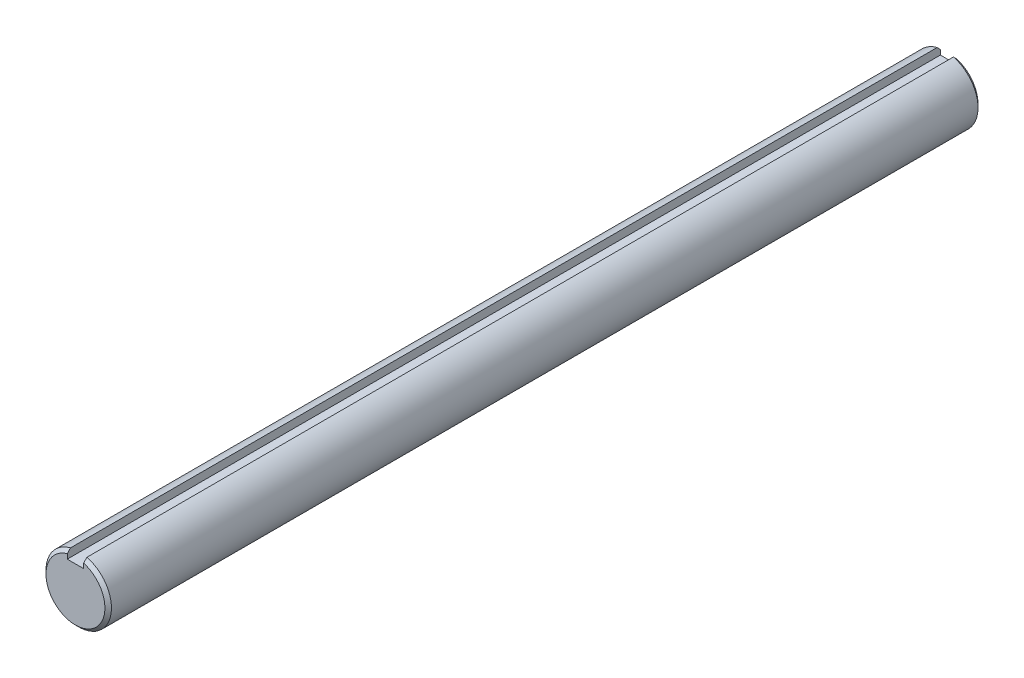
ISO-10303-21;
HEADER;
FILE_DESCRIPTION(('STEP AP214'),'2;1');
FILE_NAME('part.step','',(''),(''),'','','');
FILE_SCHEMA(('AUTOMOTIVE_DESIGN { 1 0 10303 214 1 1 1 1 }'));
ENDSEC;
DATA;
#1=APPLICATION_CONTEXT('core data for automotive mechanical design processes');
#2=APPLICATION_PROTOCOL_DEFINITION('international standard','automotive_design',2000,#1);
#3=PRODUCT_CONTEXT('',#1,'mechanical');
#4=PRODUCT('Part','Part','',(#3));
#5=PRODUCT_RELATED_PRODUCT_CATEGORY('part','',(#4));
#6=PRODUCT_DEFINITION_FORMATION('','',#4);
#7=PRODUCT_DEFINITION_CONTEXT('part definition',#1,'design');
#8=PRODUCT_DEFINITION('design','',#6,#7);
#9=PRODUCT_DEFINITION_SHAPE('','',#8);
#10=(LENGTH_UNIT() NAMED_UNIT(*) SI_UNIT(.MILLI.,.METRE.));
#11=(NAMED_UNIT(*) PLANE_ANGLE_UNIT() SI_UNIT($,.RADIAN.));
#12=(NAMED_UNIT(*) SI_UNIT($,.STERADIAN.) SOLID_ANGLE_UNIT());
#13=UNCERTAINTY_MEASURE_WITH_UNIT(LENGTH_MEASURE(1.E-05),#10,'distance_accuracy_value','');
#14=(GEOMETRIC_REPRESENTATION_CONTEXT(3) GLOBAL_UNCERTAINTY_ASSIGNED_CONTEXT((#13)) GLOBAL_UNIT_ASSIGNED_CONTEXT((#10,
#11,#12)) REPRESENTATION_CONTEXT('',''));
#15=CARTESIAN_POINT('',(0.,0.,0.));
#16=DIRECTION('',(0.,0.,1.));
#17=DIRECTION('',(1.,0.,0.));
#18=AXIS2_PLACEMENT_3D('',#15,#16,#17);
#19=CARTESIAN_POINT('',(0.,0.,127.));
#20=DIRECTION('',(0.,0.,-1.));
#21=DIRECTION('',(-1.,0.,0.));
#22=AXIS2_PLACEMENT_3D('',#19,#20,#21);
#23=CYLINDRICAL_SURFACE('',#22,9.525);
#24=DIRECTION('',(0.,0.,-1.));
#25=VECTOR('',#24,1.);
#26=CARTESIAN_POINT('',(-2.38125,9.22254159315641,127.));
#27=LINE('',#26,#25);
#28=CARTESIAN_POINT('',(-2.38125,9.22254159315641,126.0475));
#29=VERTEX_POINT('',#28);
#30=CARTESIAN_POINT('',(-2.38125,9.22254159315641,-126.0475));
#31=VERTEX_POINT('',#30);
#32=EDGE_CURVE('E122',#29,#31,#27,.T.);
#33=ORIENTED_EDGE('',*,*,#32,.T.);
#34=CARTESIAN_POINT('',(0.,0.,-126.0475));
#35=DIRECTION('',(0.,0.,1.));
#36=DIRECTION('',(1.,0.,0.));
#37=AXIS2_PLACEMENT_3D('',#34,#35,#36);
#38=CIRCLE('',#37,9.525);
#39=CARTESIAN_POINT('',(2.38125,9.22254159315641,-126.0475));
#40=VERTEX_POINT('',#39);
#41=EDGE_CURVE('E133',#31,#40,#38,.T.);
#42=ORIENTED_EDGE('',*,*,#41,.T.);
#43=DIRECTION('',(0.,0.,-1.));
#44=VECTOR('',#43,1.);
#45=CARTESIAN_POINT('',(2.38125,9.22254159315641,127.));
#46=LINE('',#45,#44);
#47=CARTESIAN_POINT('',(2.38125,9.22254159315641,126.0475));
#48=VERTEX_POINT('',#47);
#49=EDGE_CURVE('E126',#40,#48,#46,.F.);
#50=ORIENTED_EDGE('',*,*,#49,.T.);
#51=CARTESIAN_POINT('',(0.,0.,126.0475));
#52=DIRECTION('',(0.,0.,1.));
#53=DIRECTION('',(1.,0.,0.));
#54=AXIS2_PLACEMENT_3D('',#51,#52,#53);
#55=CIRCLE('',#54,9.525);
#56=EDGE_CURVE('E131',#48,#29,#55,.F.);
#57=ORIENTED_EDGE('',*,*,#56,.T.);
#58=EDGE_LOOP('',(#33,#42,#50,#57));
#59=FACE_BOUND('',#58,.T.);
#60=ADVANCED_FACE('F41',(#59),#23,.T.);
#61=CARTESIAN_POINT('',(0.,0.,127.));
#62=DIRECTION('',(0.,0.,1.));
#63=DIRECTION('',(1.,0.,0.));
#64=AXIS2_PLACEMENT_3D('',#61,#62,#63);
#65=PLANE('',#64);
#66=DIRECTION('',(0.,-1.,0.));
#67=VECTOR('',#66,1.);
#68=CARTESIAN_POINT('',(-2.38125,9.525,127.));
#69=LINE('',#68,#67);
#70=CARTESIAN_POINT('',(-2.38125,8.23513234183281,127.));
#71=VERTEX_POINT('',#70);
#72=CARTESIAN_POINT('',(-2.38125,6.84129159315641,127.));
#73=VERTEX_POINT('',#72);
#74=EDGE_CURVE('E95',#71,#73,#69,.T.);
#75=ORIENTED_EDGE('',*,*,#74,.F.);
#76=CARTESIAN_POINT('',(0.,0.,127.));
#77=DIRECTION('',(0.,0.,1.));
#78=DIRECTION('',(1.,0.,0.));
#79=AXIS2_PLACEMENT_3D('',#76,#77,#78);
#80=CIRCLE('',#79,8.57250000000004);
#81=CARTESIAN_POINT('',(2.38125,8.23513234183281,127.));
#82=VERTEX_POINT('',#81);
#83=EDGE_CURVE('E11',#71,#82,#80,.T.);
#84=ORIENTED_EDGE('',*,*,#83,.T.);
#85=DIRECTION('',(0.,1.,0.));
#86=VECTOR('',#85,1.);
#87=CARTESIAN_POINT('',(2.38125,9.525,127.));
#88=LINE('',#87,#86);
#89=CARTESIAN_POINT('',(2.38125,6.84129159315641,127.));
#90=VERTEX_POINT('',#89);
#91=EDGE_CURVE('E116',#90,#82,#88,.T.);
#92=ORIENTED_EDGE('',*,*,#91,.F.);
#93=DIRECTION('',(1.,0.,0.));
#94=VECTOR('',#93,1.);
#95=CARTESIAN_POINT('',(-2.38125,6.84129159315641,127.));
#96=LINE('',#95,#94);
#97=EDGE_CURVE('E102',#73,#90,#96,.T.);
#98=ORIENTED_EDGE('',*,*,#97,.F.);
#99=EDGE_LOOP('',(#75,#84,#92,#98));
#100=FACE_BOUND('',#99,.T.);
#101=ADVANCED_FACE('F114',(#100),#65,.T.);
#102=CARTESIAN_POINT('',(0.,0.,-127.));
#103=DIRECTION('',(0.,0.,1.));
#104=DIRECTION('',(1.,0.,0.));
#105=AXIS2_PLACEMENT_3D('',#102,#103,#104);
#106=PLANE('',#105);
#107=DIRECTION('',(0.,1.,0.));
#108=VECTOR('',#107,1.);
#109=CARTESIAN_POINT('',(2.38125,9.525,-127.));
#110=LINE('',#109,#108);
#111=CARTESIAN_POINT('',(2.38125,6.84129159315641,-127.));
#112=VERTEX_POINT('',#111);
#113=CARTESIAN_POINT('',(2.38125,8.23513234183275,-127.));
#114=VERTEX_POINT('',#113);
#115=EDGE_CURVE('E112',#112,#114,#110,.T.);
#116=ORIENTED_EDGE('',*,*,#115,.T.);
#117=CARTESIAN_POINT('',(0.,0.,-127.));
#118=DIRECTION('',(0.,0.,1.));
#119=DIRECTION('',(1.,0.,0.));
#120=AXIS2_PLACEMENT_3D('',#117,#118,#119);
#121=CIRCLE('',#120,8.57249999999998);
#122=CARTESIAN_POINT('',(-2.38125,8.23513234183275,-127.));
#123=VERTEX_POINT('',#122);
#124=EDGE_CURVE('E65',#114,#123,#121,.F.);
#125=ORIENTED_EDGE('',*,*,#124,.T.);
#126=DIRECTION('',(0.,-1.,0.));
#127=VECTOR('',#126,1.);
#128=CARTESIAN_POINT('',(-2.38125,0.,-127.));
#129=LINE('',#128,#127);
#130=CARTESIAN_POINT('',(-2.38125,6.84129159315641,-127.));
#131=VERTEX_POINT('',#130);
#132=EDGE_CURVE('E129',#123,#131,#129,.T.);
#133=ORIENTED_EDGE('',*,*,#132,.T.);
#134=DIRECTION('',(1.,0.,0.));
#135=VECTOR('',#134,1.);
#136=CARTESIAN_POINT('',(-2.38125,6.84129159315641,-127.));
#137=LINE('',#136,#135);
#138=EDGE_CURVE('E110',#131,#112,#137,.T.);
#139=ORIENTED_EDGE('',*,*,#138,.T.);
#140=EDGE_LOOP('',(#116,#125,#133,#139));
#141=FACE_BOUND('',#140,.T.);
#142=ADVANCED_FACE('F153',(#141),#106,.F.);
#143=CARTESIAN_POINT('',(2.38125,9.525,-127.));
#144=DIRECTION('',(1.,0.,0.));
#145=DIRECTION('',(0.,0.,-1.));
#146=AXIS2_PLACEMENT_3D('',#143,#144,#145);
#147=PLANE('',#146);
#148=ORIENTED_EDGE('',*,*,#49,.F.);
#149=CARTESIAN_POINT('',(2.38125,9.22254159315641,-126.0475));
#150=CARTESIAN_POINT('',(2.38125,9.05828502464502,-126.20657304499));
#151=CARTESIAN_POINT('',(2.38125,8.89387264029282,-126.365484563469));
#152=CARTESIAN_POINT('',(2.38125,8.56473622321653,-126.682984563501));
#153=CARTESIAN_POINT('',(2.38125,8.40001219046085,-126.841573045023));
#154=CARTESIAN_POINT('',(2.38125,8.23513234183275,-127.));
#155=B_SPLINE_CURVE_WITH_KNOTS('',3,(#149,#150,#151,#152,#153,#154),.UNSPECIFIED.,.F.,.F.,(4,2,
4),(0.,0.685972831459953,1.37194573249018),.UNSPECIFIED.);
#156=EDGE_CURVE('E143',#40,#114,#155,.T.);
#157=ORIENTED_EDGE('',*,*,#156,.T.);
#158=ORIENTED_EDGE('',*,*,#115,.F.);
#159=DIRECTION('',(0.,0.,1.));
#160=VECTOR('',#159,1.);
#161=CARTESIAN_POINT('',(2.38125,6.84129159315641,-127.));
#162=LINE('',#161,#160);
#163=EDGE_CURVE('E111',#112,#90,#162,.T.);
#164=ORIENTED_EDGE('',*,*,#163,.T.);
#165=ORIENTED_EDGE('',*,*,#91,.T.);
#166=CARTESIAN_POINT('',(2.38125,8.23513234183281,127.));
#167=CARTESIAN_POINT('',(2.38125,8.4000121904609,126.841573045023));
#168=CARTESIAN_POINT('',(2.38125,8.56473622321658,126.682984563501));
#169=CARTESIAN_POINT('',(2.38125,8.89387264029284,126.365484563469));
#170=CARTESIAN_POINT('',(2.38125,9.05828502464504,126.20657304499));
#171=CARTESIAN_POINT('',(2.38125,9.22254159315642,126.0475));
#172=B_SPLINE_CURVE_WITH_KNOTS('',3,(#166,#167,#168,#169,#170,#171),.UNSPECIFIED.,.F.,.F.,(4,2,
4),(0.,0.685972901030191,1.37194573249011),.UNSPECIFIED.);
#173=EDGE_CURVE('E136',#82,#48,#172,.T.);
#174=ORIENTED_EDGE('',*,*,#173,.T.);
#175=EDGE_LOOP('',(#148,#157,#158,#164,#165,#174));
#176=FACE_BOUND('',#175,.T.);
#177=ADVANCED_FACE('F149',(#176),#147,.F.);
#178=CARTESIAN_POINT('',(-2.38125,9.525,-127.));
#179=DIRECTION('',(-1.,0.,0.));
#180=DIRECTION('',(0.,0.,1.));
#181=AXIS2_PLACEMENT_3D('',#178,#179,#180);
#182=PLANE('',#181);
#183=ORIENTED_EDGE('',*,*,#132,.F.);
#184=CARTESIAN_POINT('',(-2.38125,8.23513234183275,-127.));
#185=CARTESIAN_POINT('',(-2.38125,8.40001219046085,-126.841573045023));
#186=CARTESIAN_POINT('',(-2.38125,8.56473622321653,-126.682984563501));
#187=CARTESIAN_POINT('',(-2.38125,8.89387264029282,-126.365484563469));
#188=CARTESIAN_POINT('',(-2.38125,9.05828502464503,-126.20657304499));
#189=CARTESIAN_POINT('',(-2.38125,9.22254159315642,-126.0475));
#190=B_SPLINE_CURVE_WITH_KNOTS('',3,(#184,#185,#186,#187,#188,#189),.UNSPECIFIED.,.F.,.F.,(4,2,
4),(0.,0.685972901030232,1.37194573249019),.UNSPECIFIED.);
#191=EDGE_CURVE('E50',#123,#31,#190,.T.);
#192=ORIENTED_EDGE('',*,*,#191,.T.);
#193=ORIENTED_EDGE('',*,*,#32,.F.);
#194=CARTESIAN_POINT('',(-2.38125,9.22254159315641,126.0475));
#195=CARTESIAN_POINT('',(-2.38125,9.05828502464503,126.20657304499));
#196=CARTESIAN_POINT('',(-2.38125,8.89387264029284,126.365484563469));
#197=CARTESIAN_POINT('',(-2.38125,8.56473622321657,126.682984563501));
#198=CARTESIAN_POINT('',(-2.38125,8.4000121904609,126.841573045023));
#199=CARTESIAN_POINT('',(-2.38125,8.23513234183281,127.));
#200=B_SPLINE_CURVE_WITH_KNOTS('',3,(#194,#195,#196,#197,#198,#199),.UNSPECIFIED.,.F.,.F.,(4,2,
4),(0.,0.685972831459911,1.3719457324901),.UNSPECIFIED.);
#201=EDGE_CURVE('E57',#29,#71,#200,.T.);
#202=ORIENTED_EDGE('',*,*,#201,.T.);
#203=ORIENTED_EDGE('',*,*,#74,.T.);
#204=DIRECTION('',(0.,0.,1.));
#205=VECTOR('',#204,1.);
#206=CARTESIAN_POINT('',(-2.38125,6.84129159315641,-127.));
#207=LINE('',#206,#205);
#208=EDGE_CURVE('E98',#131,#73,#207,.T.);
#209=ORIENTED_EDGE('',*,*,#208,.F.);
#210=EDGE_LOOP('',(#183,#192,#193,#202,#203,#209));
#211=FACE_BOUND('',#210,.T.);
#212=ADVANCED_FACE('F97',(#211),#182,.F.);
#213=CARTESIAN_POINT('',(-2.38125,6.84129159315641,-127.));
#214=DIRECTION('',(0.,-1.,0.));
#215=DIRECTION('',(0.,0.,-1.));
#216=AXIS2_PLACEMENT_3D('',#213,#214,#215);
#217=PLANE('',#216);
#218=ORIENTED_EDGE('',*,*,#163,.F.);
#219=ORIENTED_EDGE('',*,*,#138,.F.);
#220=ORIENTED_EDGE('',*,*,#208,.T.);
#221=ORIENTED_EDGE('',*,*,#97,.T.);
#222=EDGE_LOOP('',(#218,#219,#220,#221));
#223=FACE_BOUND('',#222,.T.);
#224=ADVANCED_FACE('F107',(#223),#217,.F.);
#225=CARTESIAN_POINT('',(0.,0.,-126.0475));
#226=DIRECTION('',(0.,0.,1.));
#227=DIRECTION('',(1.,0.,0.));
#228=AXIS2_PLACEMENT_3D('',#225,#226,#227);
#229=CONICAL_SURFACE('',#228,9.525,0.785398163397446);
#230=ORIENTED_EDGE('',*,*,#191,.F.);
#231=ORIENTED_EDGE('',*,*,#124,.F.);
#232=ORIENTED_EDGE('',*,*,#156,.F.);
#233=ORIENTED_EDGE('',*,*,#41,.F.);
#234=EDGE_LOOP('',(#230,#231,#232,#233));
#235=FACE_BOUND('',#234,.T.);
#236=ADVANCED_FACE('F158',(#235),#229,.T.);
#237=CARTESIAN_POINT('',(0.,0.,127.));
#238=DIRECTION('',(0.,0.,-1.));
#239=DIRECTION('',(-1.,0.,0.));
#240=AXIS2_PLACEMENT_3D('',#237,#238,#239);
#241=CONICAL_SURFACE('',#240,8.57250000000004,0.785398163397446);
#242=ORIENTED_EDGE('',*,*,#201,.F.);
#243=ORIENTED_EDGE('',*,*,#56,.F.);
#244=ORIENTED_EDGE('',*,*,#173,.F.);
#245=ORIENTED_EDGE('',*,*,#83,.F.);
#246=EDGE_LOOP('',(#242,#243,#244,#245));
#247=FACE_BOUND('',#246,.T.);
#248=ADVANCED_FACE('F43',(#247),#241,.T.);
#249=CLOSED_SHELL('',(#60,#101,#142,#177,#212,#224,#236,#248));
#250=MANIFOLD_SOLID_BREP('B2',#249);
#251=ADVANCED_BREP_SHAPE_REPRESENTATION('',(#18,#250),#14);
#252=SHAPE_DEFINITION_REPRESENTATION(#9,#251);
ENDSEC;
END-ISO-10303-21;
